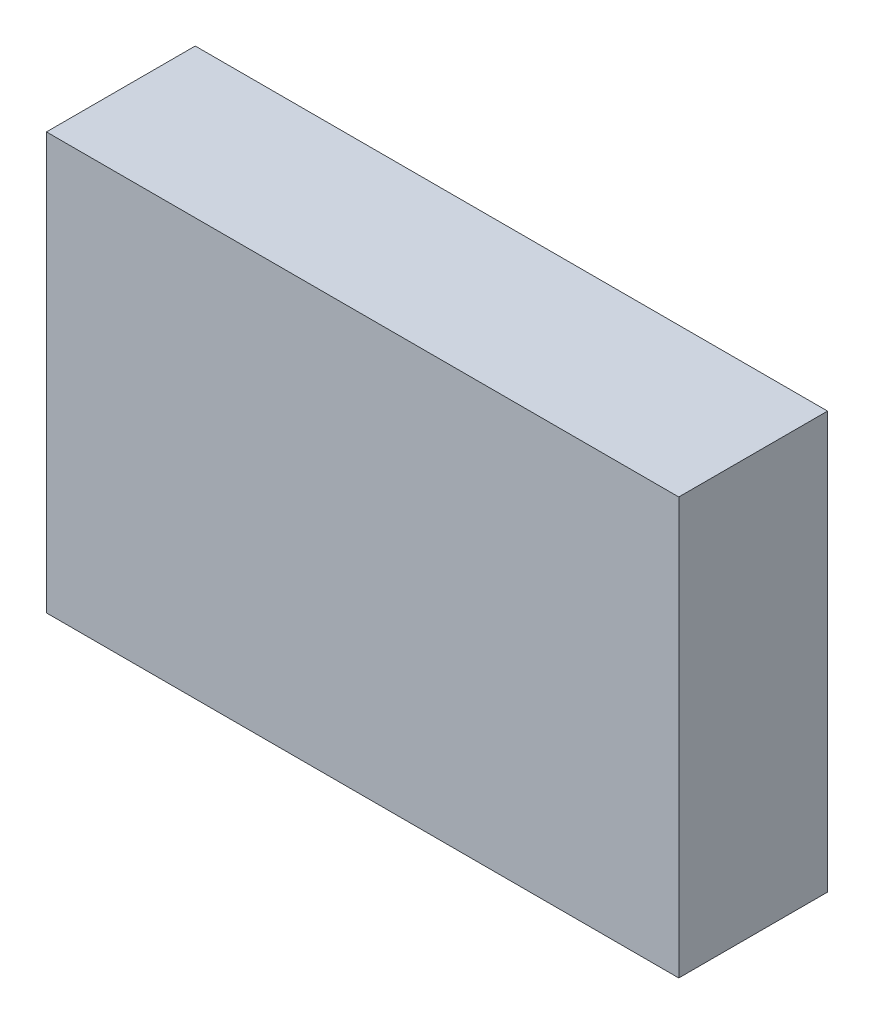
ISO-10303-21;
HEADER;
FILE_DESCRIPTION(('STEP AP214'),'2;1');
FILE_NAME('part.step','',(''),(''),'','','');
FILE_SCHEMA(('AUTOMOTIVE_DESIGN { 1 0 10303 214 1 1 1 1 }'));
ENDSEC;
DATA;
#1=APPLICATION_CONTEXT('core data for automotive mechanical design processes');
#2=APPLICATION_PROTOCOL_DEFINITION('international standard','automotive_design',2000,#1);
#3=PRODUCT_CONTEXT('',#1,'mechanical');
#4=PRODUCT('Part','Part','',(#3));
#5=PRODUCT_RELATED_PRODUCT_CATEGORY('part','',(#4));
#6=PRODUCT_DEFINITION_FORMATION('','',#4);
#7=PRODUCT_DEFINITION_CONTEXT('part definition',#1,'design');
#8=PRODUCT_DEFINITION('design','',#6,#7);
#9=PRODUCT_DEFINITION_SHAPE('','',#8);
#10=(LENGTH_UNIT() NAMED_UNIT(*) SI_UNIT(.MILLI.,.METRE.));
#11=(NAMED_UNIT(*) PLANE_ANGLE_UNIT() SI_UNIT($,.RADIAN.));
#12=(NAMED_UNIT(*) SI_UNIT($,.STERADIAN.) SOLID_ANGLE_UNIT());
#13=UNCERTAINTY_MEASURE_WITH_UNIT(LENGTH_MEASURE(1.E-05),#10,'distance_accuracy_value','');
#14=(GEOMETRIC_REPRESENTATION_CONTEXT(3) GLOBAL_UNCERTAINTY_ASSIGNED_CONTEXT((#13)) GLOBAL_UNIT_ASSIGNED_CONTEXT((#10,
#11,#12)) REPRESENTATION_CONTEXT('',''));
#15=CARTESIAN_POINT('',(0.,0.,0.));
#16=DIRECTION('',(0.,0.,1.));
#17=DIRECTION('',(1.,0.,0.));
#18=AXIS2_PLACEMENT_3D('',#15,#16,#17);
#19=CARTESIAN_POINT('',(0.,0.,20.));
#20=DIRECTION('',(1.,0.,0.));
#21=DIRECTION('',(0.,1.,0.));
#22=AXIS2_PLACEMENT_3D('',#19,#20,#21);
#23=PLANE('',#22);
#24=DIRECTION('',(0.,-1.,0.));
#25=VECTOR('',#24,1.);
#26=CARTESIAN_POINT('',(0.,0.,0.));
#27=LINE('',#26,#25);
#28=CARTESIAN_POINT('',(0.,0.,0.));
#29=VERTEX_POINT('',#28);
#30=CARTESIAN_POINT('',(0.,-56.,0.));
#31=VERTEX_POINT('',#30);
#32=EDGE_CURVE('E113',#29,#31,#27,.T.);
#33=ORIENTED_EDGE('',*,*,#32,.T.);
#34=DIRECTION('',(0.,0.,-1.));
#35=VECTOR('',#34,1.);
#36=CARTESIAN_POINT('',(0.,-56.,20.));
#37=LINE('',#36,#35);
#38=CARTESIAN_POINT('',(0.,-56.,20.));
#39=VERTEX_POINT('',#38);
#40=EDGE_CURVE('E11',#39,#31,#37,.T.);
#41=ORIENTED_EDGE('',*,*,#40,.F.);
#42=DIRECTION('',(0.,-1.,0.));
#43=VECTOR('',#42,1.);
#44=CARTESIAN_POINT('',(0.,0.,20.));
#45=LINE('',#44,#43);
#46=CARTESIAN_POINT('',(0.,0.,20.));
#47=VERTEX_POINT('',#46);
#48=EDGE_CURVE('E97',#47,#39,#45,.T.);
#49=ORIENTED_EDGE('',*,*,#48,.F.);
#50=DIRECTION('',(0.,0.,-1.));
#51=VECTOR('',#50,1.);
#52=CARTESIAN_POINT('',(0.,0.,20.));
#53=LINE('',#52,#51);
#54=EDGE_CURVE('E109',#47,#29,#53,.T.);
#55=ORIENTED_EDGE('',*,*,#54,.T.);
#56=EDGE_LOOP('',(#33,#41,#49,#55));
#57=FACE_BOUND('',#56,.T.);
#58=ADVANCED_FACE('F45',(#57),#23,.F.);
#59=CARTESIAN_POINT('',(0.,-56.,20.));
#60=DIRECTION('',(0.,1.,0.));
#61=DIRECTION('',(0.,0.,1.));
#62=AXIS2_PLACEMENT_3D('',#59,#60,#61);
#63=PLANE('',#62);
#64=DIRECTION('',(1.,0.,0.));
#65=VECTOR('',#64,1.);
#66=CARTESIAN_POINT('',(0.,-56.,0.));
#67=LINE('',#66,#65);
#68=CARTESIAN_POINT('',(85.,-56.,0.));
#69=VERTEX_POINT('',#68);
#70=EDGE_CURVE('E102',#31,#69,#67,.T.);
#71=ORIENTED_EDGE('',*,*,#70,.T.);
#72=DIRECTION('',(0.,0.,-1.));
#73=VECTOR('',#72,1.);
#74=CARTESIAN_POINT('',(85.,-56.,20.));
#75=LINE('',#74,#73);
#76=CARTESIAN_POINT('',(85.,-56.,20.));
#77=VERTEX_POINT('',#76);
#78=EDGE_CURVE('E54',#77,#69,#75,.T.);
#79=ORIENTED_EDGE('',*,*,#78,.F.);
#80=DIRECTION('',(1.,0.,0.));
#81=VECTOR('',#80,1.);
#82=CARTESIAN_POINT('',(0.,-56.,20.));
#83=LINE('',#82,#81);
#84=EDGE_CURVE('E92',#39,#77,#83,.T.);
#85=ORIENTED_EDGE('',*,*,#84,.F.);
#86=ORIENTED_EDGE('',*,*,#40,.T.);
#87=EDGE_LOOP('',(#71,#79,#85,#86));
#88=FACE_BOUND('',#87,.T.);
#89=ADVANCED_FACE('F101',(#88),#63,.F.);
#90=CARTESIAN_POINT('',(85.,0.,20.));
#91=DIRECTION('',(-1.,0.,0.));
#92=DIRECTION('',(0.,0.,1.));
#93=AXIS2_PLACEMENT_3D('',#90,#91,#92);
#94=PLANE('',#93);
#95=DIRECTION('',(0.,1.,0.));
#96=VECTOR('',#95,1.);
#97=CARTESIAN_POINT('',(85.,0.,0.));
#98=LINE('',#97,#96);
#99=CARTESIAN_POINT('',(85.,0.,0.));
#100=VERTEX_POINT('',#99);
#101=EDGE_CURVE('E79',#69,#100,#98,.T.);
#102=ORIENTED_EDGE('',*,*,#101,.T.);
#103=DIRECTION('',(0.,0.,-1.));
#104=VECTOR('',#103,1.);
#105=CARTESIAN_POINT('',(85.,0.,20.));
#106=LINE('',#105,#104);
#107=CARTESIAN_POINT('',(85.,0.,20.));
#108=VERTEX_POINT('',#107);
#109=EDGE_CURVE('E104',#108,#100,#106,.T.);
#110=ORIENTED_EDGE('',*,*,#109,.F.);
#111=DIRECTION('',(0.,1.,0.));
#112=VECTOR('',#111,1.);
#113=CARTESIAN_POINT('',(85.,0.,20.));
#114=LINE('',#113,#112);
#115=EDGE_CURVE('E95',#77,#108,#114,.T.);
#116=ORIENTED_EDGE('',*,*,#115,.F.);
#117=ORIENTED_EDGE('',*,*,#78,.T.);
#118=EDGE_LOOP('',(#102,#110,#116,#117));
#119=FACE_BOUND('',#118,.T.);
#120=ADVANCED_FACE('F105',(#119),#94,.F.);
#121=CARTESIAN_POINT('',(0.,0.,20.));
#122=DIRECTION('',(0.,-1.,0.));
#123=DIRECTION('',(0.,0.,-1.));
#124=AXIS2_PLACEMENT_3D('',#121,#122,#123);
#125=PLANE('',#124);
#126=DIRECTION('',(-1.,0.,0.));
#127=VECTOR('',#126,1.);
#128=CARTESIAN_POINT('',(0.,0.,0.));
#129=LINE('',#128,#127);
#130=EDGE_CURVE('E85',#100,#29,#129,.T.);
#131=ORIENTED_EDGE('',*,*,#130,.T.);
#132=ORIENTED_EDGE('',*,*,#54,.F.);
#133=DIRECTION('',(-1.,0.,0.));
#134=VECTOR('',#133,1.);
#135=CARTESIAN_POINT('',(0.,0.,20.));
#136=LINE('',#135,#134);
#137=EDGE_CURVE('E62',#108,#47,#136,.T.);
#138=ORIENTED_EDGE('',*,*,#137,.F.);
#139=ORIENTED_EDGE('',*,*,#109,.T.);
#140=EDGE_LOOP('',(#131,#132,#138,#139));
#141=FACE_BOUND('',#140,.T.);
#142=ADVANCED_FACE('F126',(#141),#125,.F.);
#143=CARTESIAN_POINT('',(0.,0.,20.));
#144=DIRECTION('',(0.,0.,1.));
#145=DIRECTION('',(1.,0.,0.));
#146=AXIS2_PLACEMENT_3D('',#143,#144,#145);
#147=PLANE('',#146);
#148=ORIENTED_EDGE('',*,*,#48,.T.);
#149=ORIENTED_EDGE('',*,*,#84,.T.);
#150=ORIENTED_EDGE('',*,*,#115,.T.);
#151=ORIENTED_EDGE('',*,*,#137,.T.);
#152=EDGE_LOOP('',(#148,#149,#150,#151));
#153=FACE_BOUND('',#152,.T.);
#154=ADVANCED_FACE('F93',(#153),#147,.T.);
#155=CARTESIAN_POINT('',(0.,0.,0.));
#156=DIRECTION('',(0.,0.,1.));
#157=DIRECTION('',(1.,0.,0.));
#158=AXIS2_PLACEMENT_3D('',#155,#156,#157);
#159=PLANE('',#158);
#160=ORIENTED_EDGE('',*,*,#32,.F.);
#161=ORIENTED_EDGE('',*,*,#130,.F.);
#162=ORIENTED_EDGE('',*,*,#101,.F.);
#163=ORIENTED_EDGE('',*,*,#70,.F.);
#164=EDGE_LOOP('',(#160,#161,#162,#163));
#165=FACE_BOUND('',#164,.T.);
#166=ADVANCED_FACE('F129',(#165),#159,.F.);
#167=CLOSED_SHELL('',(#58,#89,#120,#142,#154,#166));
#168=MANIFOLD_SOLID_BREP('B2',#167);
#169=ADVANCED_BREP_SHAPE_REPRESENTATION('',(#18,#168),#14);
#170=SHAPE_DEFINITION_REPRESENTATION(#9,#169);
ENDSEC;
END-ISO-10303-21;
